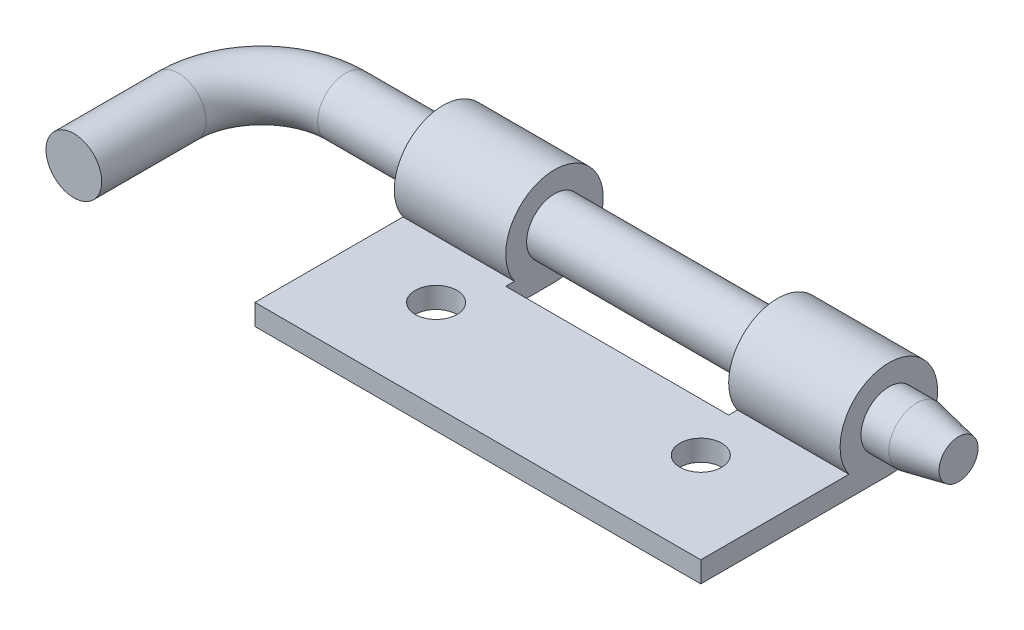
ISO-10303-21;
HEADER;
FILE_DESCRIPTION(('STEP AP214'),'2;1');
FILE_NAME('part.step','',(''),(''),'','','');
FILE_SCHEMA(('AUTOMOTIVE_DESIGN { 1 0 10303 214 1 1 1 1 }'));
ENDSEC;
DATA;
#1=APPLICATION_CONTEXT('core data for automotive mechanical design processes');
#2=APPLICATION_PROTOCOL_DEFINITION('international standard','automotive_design',2000,#1);
#3=PRODUCT_CONTEXT('',#1,'mechanical');
#4=PRODUCT('Part','Part','',(#3));
#5=PRODUCT_RELATED_PRODUCT_CATEGORY('part','',(#4));
#6=PRODUCT_DEFINITION_FORMATION('','',#4);
#7=PRODUCT_DEFINITION_CONTEXT('part definition',#1,'design');
#8=PRODUCT_DEFINITION('design','',#6,#7);
#9=PRODUCT_DEFINITION_SHAPE('','',#8);
#10=(LENGTH_UNIT() NAMED_UNIT(*) SI_UNIT(.MILLI.,.METRE.));
#11=(NAMED_UNIT(*) PLANE_ANGLE_UNIT() SI_UNIT($,.RADIAN.));
#12=(NAMED_UNIT(*) SI_UNIT($,.STERADIAN.) SOLID_ANGLE_UNIT());
#13=UNCERTAINTY_MEASURE_WITH_UNIT(LENGTH_MEASURE(1.E-05),#10,'distance_accuracy_value','');
#14=(GEOMETRIC_REPRESENTATION_CONTEXT(3) GLOBAL_UNCERTAINTY_ASSIGNED_CONTEXT((#13)) GLOBAL_UNIT_ASSIGNED_CONTEXT((#10,
#11,#12)) REPRESENTATION_CONTEXT('',''));
#15=CARTESIAN_POINT('',(0.,0.,0.));
#16=DIRECTION('',(0.,0.,1.));
#17=DIRECTION('',(1.,0.,0.));
#18=AXIS2_PLACEMENT_3D('',#15,#16,#17);
#19=CARTESIAN_POINT('',(37.,0.,0.));
#20=DIRECTION('',(-1.,0.,0.));
#21=DIRECTION('',(0.,0.,1.));
#22=AXIS2_PLACEMENT_3D('',#19,#20,#21);
#23=CYLINDRICAL_SURFACE('',#22,2.);
#24=CARTESIAN_POINT('',(32.,0.,0.));
#25=DIRECTION('',(-1.,0.,0.));
#26=DIRECTION('',(0.,0.,1.));
#27=AXIS2_PLACEMENT_3D('',#24,#25,#26);
#28=CIRCLE('',#27,2.);
#29=CARTESIAN_POINT('',(32.,0.,2.));
#30=VERTEX_POINT('',#29);
#31=EDGE_CURVE('E55',#30,#30,#28,.F.);
#32=ORIENTED_EDGE('',*,*,#31,.T.);
#33=EDGE_LOOP('',(#32));
#34=FACE_BOUND('',#33,.T.);
#35=CARTESIAN_POINT('',(34.,0.,0.));
#36=DIRECTION('',(-1.,0.,0.));
#37=DIRECTION('',(0.,0.,1.));
#38=AXIS2_PLACEMENT_3D('',#35,#36,#37);
#39=CIRCLE('',#38,2.);
#40=CARTESIAN_POINT('',(34.,0.,2.));
#41=VERTEX_POINT('',#40);
#42=EDGE_CURVE('E465',#41,#41,#39,.T.);
#43=ORIENTED_EDGE('',*,*,#42,.T.);
#44=EDGE_LOOP('',(#43));
#45=FACE_BOUND('',#44,.T.);
#46=ADVANCED_FACE('F45',(#34,#45),#23,.T.);
#47=CARTESIAN_POINT('',(8.,0.,0.));
#48=DIRECTION('',(-1.,0.,0.));
#49=DIRECTION('',(0.,0.,1.));
#50=AXIS2_PLACEMENT_3D('',#47,#48,#49);
#51=CYLINDRICAL_SURFACE('',#50,3.5);
#52=CARTESIAN_POINT('',(0.,0.,0.));
#53=DIRECTION('',(1.,0.,0.));
#54=DIRECTION('',(0.,0.,-1.));
#55=AXIS2_PLACEMENT_3D('',#52,#53,#54);
#56=CIRCLE('',#55,3.5);
#57=CARTESIAN_POINT('',(0.,-3.5,0.));
#58=VERTEX_POINT('',#57);
#59=CARTESIAN_POINT('',(0.,-2.,2.87228132326901));
#60=VERTEX_POINT('',#59);
#61=EDGE_CURVE('E174',#58,#60,#56,.T.);
#62=ORIENTED_EDGE('',*,*,#61,.T.);
#63=DIRECTION('',(-1.,0.,0.));
#64=VECTOR('',#63,1.);
#65=CARTESIAN_POINT('',(8.,-2.,2.87228132326901));
#66=LINE('',#65,#64);
#67=CARTESIAN_POINT('',(8.,-2.,2.87228132326901));
#68=VERTEX_POINT('',#67);
#69=EDGE_CURVE('E63',#60,#68,#66,.F.);
#70=ORIENTED_EDGE('',*,*,#69,.T.);
#71=CARTESIAN_POINT('',(8.,0.,0.));
#72=DIRECTION('',(1.,0.,0.));
#73=DIRECTION('',(0.,0.,-1.));
#74=AXIS2_PLACEMENT_3D('',#71,#72,#73);
#75=CIRCLE('',#74,3.5);
#76=CARTESIAN_POINT('',(8.,-3.5,0.));
#77=VERTEX_POINT('',#76);
#78=EDGE_CURVE('E175',#77,#68,#75,.T.);
#79=ORIENTED_EDGE('',*,*,#78,.F.);
#80=DIRECTION('',(-1.,0.,0.));
#81=VECTOR('',#80,1.);
#82=CARTESIAN_POINT('',(0.,-3.5,0.));
#83=LINE('',#82,#81);
#84=EDGE_CURVE('E68',#77,#58,#83,.T.);
#85=ORIENTED_EDGE('',*,*,#84,.T.);
#86=EDGE_LOOP('',(#62,#70,#79,#85));
#87=FACE_BOUND('',#86,.T.);
#88=ADVANCED_FACE('F47',(#87),#51,.T.);
#89=CARTESIAN_POINT('',(8.,0.,0.));
#90=DIRECTION('',(1.,0.,0.));
#91=DIRECTION('',(0.,0.,-1.));
#92=AXIS2_PLACEMENT_3D('',#89,#90,#91);
#93=PLANE('',#92);
#94=CARTESIAN_POINT('',(8.,0.,0.));
#95=DIRECTION('',(1.,0.,0.));
#96=DIRECTION('',(0.,0.,-1.));
#97=AXIS2_PLACEMENT_3D('',#94,#95,#96);
#98=CIRCLE('',#97,2.);
#99=CARTESIAN_POINT('',(8.,0.,-2.));
#100=VERTEX_POINT('',#99);
#101=EDGE_CURVE('E227',#100,#100,#98,.F.);
#102=ORIENTED_EDGE('',*,*,#101,.T.);
#103=EDGE_LOOP('',(#102));
#104=FACE_BOUND('',#103,.T.);
#105=ORIENTED_EDGE('',*,*,#78,.T.);
#106=DIRECTION('',(0.,0.,-1.));
#107=VECTOR('',#106,1.);
#108=CARTESIAN_POINT('',(8.,-2.,0.));
#109=LINE('',#108,#107);
#110=CARTESIAN_POINT('',(8.,-2.,3.5));
#111=VERTEX_POINT('',#110);
#112=EDGE_CURVE('E162',#111,#68,#109,.T.);
#113=ORIENTED_EDGE('',*,*,#112,.F.);
#114=DIRECTION('',(0.,-1.,0.));
#115=VECTOR('',#114,1.);
#116=CARTESIAN_POINT('',(8.,-2.,3.5));
#117=LINE('',#116,#115);
#118=CARTESIAN_POINT('',(8.,-3.5,3.5));
#119=VERTEX_POINT('',#118);
#120=EDGE_CURVE('E157',#111,#119,#117,.T.);
#121=ORIENTED_EDGE('',*,*,#120,.T.);
#122=DIRECTION('',(0.,0.,-1.));
#123=VECTOR('',#122,1.);
#124=CARTESIAN_POINT('',(8.,-3.5,0.));
#125=LINE('',#124,#123);
#126=EDGE_CURVE('E150',#119,#77,#125,.T.);
#127=ORIENTED_EDGE('',*,*,#126,.T.);
#128=EDGE_LOOP('',(#105,#113,#121,#127));
#129=FACE_BOUND('',#128,.T.);
#130=ADVANCED_FACE('F217',(#104,#129),#93,.T.);
#131=CARTESIAN_POINT('',(0.,0.,0.));
#132=DIRECTION('',(1.,0.,0.));
#133=DIRECTION('',(0.,0.,-1.));
#134=AXIS2_PLACEMENT_3D('',#131,#132,#133);
#135=PLANE('',#134);
#136=CARTESIAN_POINT('',(0.,0.,0.));
#137=DIRECTION('',(1.,0.,0.));
#138=DIRECTION('',(0.,0.,-1.));
#139=AXIS2_PLACEMENT_3D('',#136,#137,#138);
#140=CIRCLE('',#139,2.);
#141=CARTESIAN_POINT('',(0.,0.,-2.));
#142=VERTEX_POINT('',#141);
#143=EDGE_CURVE('E11',#142,#142,#140,.F.);
#144=ORIENTED_EDGE('',*,*,#143,.F.);
#145=EDGE_LOOP('',(#144));
#146=FACE_BOUND('',#145,.T.);
#147=ORIENTED_EDGE('',*,*,#61,.F.);
#148=DIRECTION('',(0.,0.,1.));
#149=VECTOR('',#148,1.);
#150=CARTESIAN_POINT('',(0.,-3.5,0.));
#151=LINE('',#150,#149);
#152=CARTESIAN_POINT('',(0.,-3.5,13.5));
#153=VERTEX_POINT('',#152);
#154=EDGE_CURVE('E209',#58,#153,#151,.T.);
#155=ORIENTED_EDGE('',*,*,#154,.T.);
#156=DIRECTION('',(0.,-1.,0.));
#157=VECTOR('',#156,1.);
#158=CARTESIAN_POINT('',(0.,-2.,13.5));
#159=LINE('',#158,#157);
#160=CARTESIAN_POINT('',(0.,-2.,13.5));
#161=VERTEX_POINT('',#160);
#162=EDGE_CURVE('E168',#161,#153,#159,.T.);
#163=ORIENTED_EDGE('',*,*,#162,.F.);
#164=DIRECTION('',(0.,0.,1.));
#165=VECTOR('',#164,1.);
#166=CARTESIAN_POINT('',(0.,-2.,0.));
#167=LINE('',#166,#165);
#168=EDGE_CURVE('E156',#60,#161,#167,.T.);
#169=ORIENTED_EDGE('',*,*,#168,.F.);
#170=EDGE_LOOP('',(#147,#155,#163,#169));
#171=FACE_BOUND('',#170,.T.);
#172=ADVANCED_FACE('F188',(#146,#171),#135,.F.);
#173=CARTESIAN_POINT('',(0.,-2.,0.));
#174=DIRECTION('',(0.,1.,0.));
#175=DIRECTION('',(0.,0.,1.));
#176=AXIS2_PLACEMENT_3D('',#173,#174,#175);
#177=PLANE('',#176);
#178=DIRECTION('',(-1.,0.,0.));
#179=VECTOR('',#178,1.);
#180=CARTESIAN_POINT('',(32.,-2.,2.87228132326901));
#181=LINE('',#180,#179);
#182=CARTESIAN_POINT('',(24.,-2.,2.87228132326901));
#183=VERTEX_POINT('',#182);
#184=CARTESIAN_POINT('',(32.,-2.,2.87228132326901));
#185=VERTEX_POINT('',#184);
#186=EDGE_CURVE('E119',#183,#185,#181,.F.);
#187=ORIENTED_EDGE('',*,*,#186,.F.);
#188=DIRECTION('',(0.,0.,1.));
#189=VECTOR('',#188,1.);
#190=CARTESIAN_POINT('',(24.,-2.,3.5));
#191=LINE('',#190,#189);
#192=CARTESIAN_POINT('',(24.,-2.,3.5));
#193=VERTEX_POINT('',#192);
#194=EDGE_CURVE('E201',#183,#193,#191,.T.);
#195=ORIENTED_EDGE('',*,*,#194,.T.);
#196=DIRECTION('',(-1.,0.,0.));
#197=VECTOR('',#196,1.);
#198=CARTESIAN_POINT('',(8.,-2.,3.5));
#199=LINE('',#198,#197);
#200=EDGE_CURVE('E204',#193,#111,#199,.T.);
#201=ORIENTED_EDGE('',*,*,#200,.T.);
#202=ORIENTED_EDGE('',*,*,#112,.T.);
#203=ORIENTED_EDGE('',*,*,#69,.F.);
#204=ORIENTED_EDGE('',*,*,#168,.T.);
#205=DIRECTION('',(1.,0.,0.));
#206=VECTOR('',#205,1.);
#207=CARTESIAN_POINT('',(0.,-2.,13.5));
#208=LINE('',#207,#206);
#209=CARTESIAN_POINT('',(32.,-2.,13.5));
#210=VERTEX_POINT('',#209);
#211=EDGE_CURVE('E190',#161,#210,#208,.T.);
#212=ORIENTED_EDGE('',*,*,#211,.T.);
#213=DIRECTION('',(0.,0.,-1.));
#214=VECTOR('',#213,1.);
#215=CARTESIAN_POINT('',(32.,-2.,0.));
#216=LINE('',#215,#214);
#217=EDGE_CURVE('E193',#210,#185,#216,.T.);
#218=ORIENTED_EDGE('',*,*,#217,.T.);
#219=EDGE_LOOP('',(#187,#195,#201,#202,#203,#204,#212,#218));
#220=FACE_BOUND('',#219,.T.);
#221=CARTESIAN_POINT('',(6.5,-2.,7.));
#222=DIRECTION('',(0.,1.,0.));
#223=DIRECTION('',(0.,0.,1.));
#224=AXIS2_PLACEMENT_3D('',#221,#222,#223);
#225=CIRCLE('',#224,1.5);
#226=CARTESIAN_POINT('',(6.5,-2.,8.5));
#227=VERTEX_POINT('',#226);
#228=EDGE_CURVE('E237',#227,#227,#225,.T.);
#229=ORIENTED_EDGE('',*,*,#228,.F.);
#230=EDGE_LOOP('',(#229));
#231=FACE_BOUND('',#230,.T.);
#232=CARTESIAN_POINT('',(25.5,-2.,7.));
#233=DIRECTION('',(0.,1.,0.));
#234=DIRECTION('',(0.,0.,1.));
#235=AXIS2_PLACEMENT_3D('',#232,#233,#234);
#236=CIRCLE('',#235,1.5);
#237=CARTESIAN_POINT('',(25.5,-2.,8.5));
#238=VERTEX_POINT('',#237);
#239=EDGE_CURVE('E211',#238,#238,#236,.T.);
#240=ORIENTED_EDGE('',*,*,#239,.F.);
#241=EDGE_LOOP('',(#240));
#242=FACE_BOUND('',#241,.T.);
#243=ADVANCED_FACE('F183',(#220,#231,#242),#177,.T.);
#244=CARTESIAN_POINT('',(0.,-3.5,0.));
#245=DIRECTION('',(0.,1.,0.));
#246=DIRECTION('',(0.,0.,1.));
#247=AXIS2_PLACEMENT_3D('',#244,#245,#246);
#248=PLANE('',#247);
#249=ORIENTED_EDGE('',*,*,#154,.F.);
#250=ORIENTED_EDGE('',*,*,#84,.F.);
#251=ORIENTED_EDGE('',*,*,#126,.F.);
#252=DIRECTION('',(-1.,0.,0.));
#253=VECTOR('',#252,1.);
#254=CARTESIAN_POINT('',(8.,-3.5,3.5));
#255=LINE('',#254,#253);
#256=CARTESIAN_POINT('',(24.,-3.5,3.5));
#257=VERTEX_POINT('',#256);
#258=EDGE_CURVE('E144',#257,#119,#255,.T.);
#259=ORIENTED_EDGE('',*,*,#258,.F.);
#260=DIRECTION('',(0.,0.,1.));
#261=VECTOR('',#260,1.);
#262=CARTESIAN_POINT('',(24.,-3.5,3.5));
#263=LINE('',#262,#261);
#264=CARTESIAN_POINT('',(24.,-3.5,0.));
#265=VERTEX_POINT('',#264);
#266=EDGE_CURVE('E140',#265,#257,#263,.T.);
#267=ORIENTED_EDGE('',*,*,#266,.F.);
#268=DIRECTION('',(-1.,0.,0.));
#269=VECTOR('',#268,1.);
#270=CARTESIAN_POINT('',(24.,-3.5,0.));
#271=LINE('',#270,#269);
#272=CARTESIAN_POINT('',(32.,-3.5,0.));
#273=VERTEX_POINT('',#272);
#274=EDGE_CURVE('E116',#273,#265,#271,.T.);
#275=ORIENTED_EDGE('',*,*,#274,.F.);
#276=DIRECTION('',(0.,0.,-1.));
#277=VECTOR('',#276,1.);
#278=CARTESIAN_POINT('',(32.,-3.5,0.));
#279=LINE('',#278,#277);
#280=CARTESIAN_POINT('',(32.,-3.5,13.5));
#281=VERTEX_POINT('',#280);
#282=EDGE_CURVE('E128',#281,#273,#279,.T.);
#283=ORIENTED_EDGE('',*,*,#282,.F.);
#284=DIRECTION('',(1.,0.,0.));
#285=VECTOR('',#284,1.);
#286=CARTESIAN_POINT('',(0.,-3.5,13.5));
#287=LINE('',#286,#285);
#288=EDGE_CURVE('E134',#153,#281,#287,.T.);
#289=ORIENTED_EDGE('',*,*,#288,.F.);
#290=EDGE_LOOP('',(#249,#250,#251,#259,#267,#275,#283,#289));
#291=FACE_BOUND('',#290,.T.);
#292=CARTESIAN_POINT('',(25.5,-3.5,7.));
#293=DIRECTION('',(0.,1.,0.));
#294=DIRECTION('',(0.,0.,1.));
#295=AXIS2_PLACEMENT_3D('',#292,#293,#294);
#296=CIRCLE('',#295,1.5);
#297=CARTESIAN_POINT('',(25.5,-3.5,8.5));
#298=VERTEX_POINT('',#297);
#299=EDGE_CURVE('E196',#298,#298,#296,.T.);
#300=ORIENTED_EDGE('',*,*,#299,.T.);
#301=EDGE_LOOP('',(#300));
#302=FACE_BOUND('',#301,.T.);
#303=CARTESIAN_POINT('',(6.5,-3.5,7.));
#304=DIRECTION('',(0.,1.,0.));
#305=DIRECTION('',(0.,0.,1.));
#306=AXIS2_PLACEMENT_3D('',#303,#304,#305);
#307=CIRCLE('',#306,1.5);
#308=CARTESIAN_POINT('',(6.5,-3.5,8.5));
#309=VERTEX_POINT('',#308);
#310=EDGE_CURVE('E236',#309,#309,#307,.T.);
#311=ORIENTED_EDGE('',*,*,#310,.T.);
#312=EDGE_LOOP('',(#311));
#313=FACE_BOUND('',#312,.T.);
#314=ADVANCED_FACE('F137',(#291,#302,#313),#248,.F.);
#315=CARTESIAN_POINT('',(0.,-2.,13.5));
#316=DIRECTION('',(0.,0.,-1.));
#317=DIRECTION('',(-1.,0.,0.));
#318=AXIS2_PLACEMENT_3D('',#315,#316,#317);
#319=PLANE('',#318);
#320=ORIENTED_EDGE('',*,*,#288,.T.);
#321=DIRECTION('',(0.,-1.,0.));
#322=VECTOR('',#321,1.);
#323=CARTESIAN_POINT('',(32.,-2.,13.5));
#324=LINE('',#323,#322);
#325=EDGE_CURVE('E131',#210,#281,#324,.T.);
#326=ORIENTED_EDGE('',*,*,#325,.F.);
#327=ORIENTED_EDGE('',*,*,#211,.F.);
#328=ORIENTED_EDGE('',*,*,#162,.T.);
#329=EDGE_LOOP('',(#320,#326,#327,#328));
#330=FACE_BOUND('',#329,.T.);
#331=ADVANCED_FACE('F214',(#330),#319,.F.);
#332=CARTESIAN_POINT('',(32.,-2.,0.));
#333=DIRECTION('',(-1.,0.,0.));
#334=DIRECTION('',(0.,0.,1.));
#335=AXIS2_PLACEMENT_3D('',#332,#333,#334);
#336=PLANE('',#335);
#337=ORIENTED_EDGE('',*,*,#31,.F.);
#338=EDGE_LOOP('',(#337));
#339=FACE_BOUND('',#338,.T.);
#340=CARTESIAN_POINT('',(32.,0.,0.));
#341=DIRECTION('',(-1.,0.,0.));
#342=DIRECTION('',(0.,0.,1.));
#343=AXIS2_PLACEMENT_3D('',#340,#341,#342);
#344=CIRCLE('',#343,3.5);
#345=EDGE_CURVE('E112',#185,#273,#344,.T.);
#346=ORIENTED_EDGE('',*,*,#345,.F.);
#347=ORIENTED_EDGE('',*,*,#217,.F.);
#348=ORIENTED_EDGE('',*,*,#325,.T.);
#349=ORIENTED_EDGE('',*,*,#282,.T.);
#350=EDGE_LOOP('',(#346,#347,#348,#349));
#351=FACE_BOUND('',#350,.T.);
#352=ADVANCED_FACE('F129',(#339,#351),#336,.F.);
#353=CARTESIAN_POINT('',(24.,-2.,3.5));
#354=DIRECTION('',(1.,0.,0.));
#355=DIRECTION('',(0.,0.,-1.));
#356=AXIS2_PLACEMENT_3D('',#353,#354,#355);
#357=PLANE('',#356);
#358=CARTESIAN_POINT('',(24.,0.,0.));
#359=DIRECTION('',(1.,0.,0.));
#360=DIRECTION('',(0.,0.,-1.));
#361=AXIS2_PLACEMENT_3D('',#358,#359,#360);
#362=CIRCLE('',#361,2.);
#363=CARTESIAN_POINT('',(24.,0.,-2.));
#364=VERTEX_POINT('',#363);
#365=EDGE_CURVE('E49',#364,#364,#362,.F.);
#366=ORIENTED_EDGE('',*,*,#365,.F.);
#367=EDGE_LOOP('',(#366));
#368=FACE_BOUND('',#367,.T.);
#369=ORIENTED_EDGE('',*,*,#194,.F.);
#370=CARTESIAN_POINT('',(24.,0.,0.));
#371=DIRECTION('',(-1.,0.,0.));
#372=DIRECTION('',(0.,0.,1.));
#373=AXIS2_PLACEMENT_3D('',#370,#371,#372);
#374=CIRCLE('',#373,3.5);
#375=EDGE_CURVE('E124',#183,#265,#374,.T.);
#376=ORIENTED_EDGE('',*,*,#375,.T.);
#377=ORIENTED_EDGE('',*,*,#266,.T.);
#378=DIRECTION('',(0.,-1.,0.));
#379=VECTOR('',#378,1.);
#380=CARTESIAN_POINT('',(24.,-2.,3.5));
#381=LINE('',#380,#379);
#382=EDGE_CURVE('E161',#193,#257,#381,.T.);
#383=ORIENTED_EDGE('',*,*,#382,.F.);
#384=EDGE_LOOP('',(#369,#376,#377,#383));
#385=FACE_BOUND('',#384,.T.);
#386=ADVANCED_FACE('F225',(#368,#385),#357,.F.);
#387=CARTESIAN_POINT('',(8.,-2.,3.5));
#388=DIRECTION('',(0.,0.,1.));
#389=DIRECTION('',(1.,0.,0.));
#390=AXIS2_PLACEMENT_3D('',#387,#388,#389);
#391=PLANE('',#390);
#392=ORIENTED_EDGE('',*,*,#258,.T.);
#393=ORIENTED_EDGE('',*,*,#120,.F.);
#394=ORIENTED_EDGE('',*,*,#200,.F.);
#395=ORIENTED_EDGE('',*,*,#382,.T.);
#396=EDGE_LOOP('',(#392,#393,#394,#395));
#397=FACE_BOUND('',#396,.T.);
#398=ADVANCED_FACE('F221',(#397),#391,.F.);
#399=CARTESIAN_POINT('',(25.5,-2.,7.));
#400=DIRECTION('',(0.,-1.,0.));
#401=DIRECTION('',(0.,0.,-1.));
#402=AXIS2_PLACEMENT_3D('',#399,#400,#401);
#403=CYLINDRICAL_SURFACE('',#402,1.5);
#404=ORIENTED_EDGE('',*,*,#239,.T.);
#405=EDGE_LOOP('',(#404));
#406=FACE_BOUND('',#405,.T.);
#407=ORIENTED_EDGE('',*,*,#299,.F.);
#408=EDGE_LOOP('',(#407));
#409=FACE_BOUND('',#408,.T.);
#410=ADVANCED_FACE('F252',(#406,#409),#403,.F.);
#411=CARTESIAN_POINT('',(6.5,-2.,7.));
#412=DIRECTION('',(0.,-1.,0.));
#413=DIRECTION('',(0.,0.,-1.));
#414=AXIS2_PLACEMENT_3D('',#411,#412,#413);
#415=CYLINDRICAL_SURFACE('',#414,1.5);
#416=ORIENTED_EDGE('',*,*,#228,.T.);
#417=EDGE_LOOP('',(#416));
#418=FACE_BOUND('',#417,.T.);
#419=ORIENTED_EDGE('',*,*,#310,.F.);
#420=EDGE_LOOP('',(#419));
#421=FACE_BOUND('',#420,.T.);
#422=ADVANCED_FACE('F254',(#418,#421),#415,.F.);
#423=CARTESIAN_POINT('',(32.,0.,0.));
#424=DIRECTION('',(-1.,0.,0.));
#425=DIRECTION('',(0.,0.,1.));
#426=AXIS2_PLACEMENT_3D('',#423,#424,#425);
#427=CYLINDRICAL_SURFACE('',#426,3.5);
#428=ORIENTED_EDGE('',*,*,#375,.F.);
#429=ORIENTED_EDGE('',*,*,#186,.T.);
#430=ORIENTED_EDGE('',*,*,#345,.T.);
#431=ORIENTED_EDGE('',*,*,#274,.T.);
#432=EDGE_LOOP('',(#428,#429,#430,#431));
#433=FACE_BOUND('',#432,.T.);
#434=ADVANCED_FACE('F114',(#433),#427,.T.);
#435=ORIENTED_EDGE('',*,*,#101,.F.);
#436=EDGE_LOOP('',(#435));
#437=FACE_BOUND('',#436,.T.);
#438=ORIENTED_EDGE('',*,*,#365,.T.);
#439=EDGE_LOOP('',(#438));
#440=FACE_BOUND('',#439,.T.);
#441=ADVANCED_FACE('F267',(#437,#440),#23,.T.);
#442=CARTESIAN_POINT('',(-7.,0.,0.));
#443=DIRECTION('',(1.,0.,0.));
#444=DIRECTION('',(0.,0.,-1.));
#445=AXIS2_PLACEMENT_3D('',#442,#443,#444);
#446=CIRCLE('',#445,2.);
#447=CARTESIAN_POINT('',(-7.,0.,-2.));
#448=VERTEX_POINT('',#447);
#449=EDGE_CURVE('E462',#448,#448,#446,.T.);
#450=ORIENTED_EDGE('',*,*,#449,.T.);
#451=EDGE_LOOP('',(#450));
#452=FACE_BOUND('',#451,.T.);
#453=ORIENTED_EDGE('',*,*,#143,.T.);
#454=EDGE_LOOP('',(#453));
#455=FACE_BOUND('',#454,.T.);
#456=ADVANCED_FACE('F268',(#452,#455),#23,.T.);
#457=CARTESIAN_POINT('',(-13.,0.,13.5));
#458=DIRECTION('',(0.,0.,-1.));
#459=DIRECTION('',(-1.,0.,0.));
#460=AXIS2_PLACEMENT_3D('',#457,#458,#459);
#461=PLANE('',#460);
#462=CARTESIAN_POINT('',(-13.,0.,13.5));
#463=DIRECTION('',(0.,0.,-1.));
#464=DIRECTION('',(-1.,0.,0.));
#465=AXIS2_PLACEMENT_3D('',#462,#463,#464);
#466=CIRCLE('',#465,2.);
#467=CARTESIAN_POINT('',(-15.,0.,13.5));
#468=VERTEX_POINT('',#467);
#469=EDGE_CURVE('E231',#468,#468,#466,.T.);
#470=ORIENTED_EDGE('',*,*,#469,.F.);
#471=EDGE_LOOP('',(#470));
#472=FACE_BOUND('',#471,.T.);
#473=ADVANCED_FACE('F281',(#472),#461,.F.);
#474=CARTESIAN_POINT('',(-7.,0.,6.00000000000001));
#475=DIRECTION('',(0.,1.,0.));
#476=DIRECTION('',(0.,0.,1.));
#477=AXIS2_PLACEMENT_3D('',#474,#475,#476);
#478=TOROIDAL_SURFACE('',#477,6.00000000000002,2.);
#479=CARTESIAN_POINT('',(-13.,0.,6.00000000000001));
#480=DIRECTION('',(0.,0.,-1.));
#481=DIRECTION('',(-1.,0.,0.));
#482=AXIS2_PLACEMENT_3D('',#479,#480,#481);
#483=CIRCLE('',#482,2.);
#484=CARTESIAN_POINT('',(-15.,0.,6.00000000000001));
#485=VERTEX_POINT('',#484);
#486=EDGE_CURVE('E458',#485,#485,#483,.T.);
#487=CARTESIAN_POINT('',(-7.,0.,6.00000000000001));
#488=DIRECTION('',(0.,1.,0.));
#489=DIRECTION('',(0.,0.,1.));
#490=AXIS2_PLACEMENT_3D('',#487,#488,#489);
#491=CIRCLE('',#490,8.00000000000001);
#492=EDGE_CURVE('',#448,#485,#491,.T.);
#493=ORIENTED_EDGE('',*,*,#449,.F.);
#494=ORIENTED_EDGE('',*,*,#486,.T.);
#495=ORIENTED_EDGE('',*,*,#492,.T.);
#496=ORIENTED_EDGE('',*,*,#492,.F.);
#497=EDGE_LOOP('',(#493,#495,#494,#496));
#498=FACE_BOUND('',#497,.T.);
#499=ADVANCED_FACE('F287',(#498),#478,.T.);
#500=CARTESIAN_POINT('',(-13.,0.,6.00000000000001));
#501=DIRECTION('',(0.,0.,1.));
#502=DIRECTION('',(1.,0.,0.));
#503=AXIS2_PLACEMENT_3D('',#500,#501,#502);
#504=CYLINDRICAL_SURFACE('',#503,2.);
#505=ORIENTED_EDGE('',*,*,#469,.T.);
#506=EDGE_LOOP('',(#505));
#507=FACE_BOUND('',#506,.T.);
#508=ORIENTED_EDGE('',*,*,#486,.F.);
#509=EDGE_LOOP('',(#508));
#510=FACE_BOUND('',#509,.T.);
#511=ADVANCED_FACE('F283',(#507,#510),#504,.T.);
#512=CARTESIAN_POINT('',(34.,0.,0.));
#513=DIRECTION('',(-1.,0.,0.));
#514=DIRECTION('',(0.,0.,1.));
#515=AXIS2_PLACEMENT_3D('',#512,#513,#514);
#516=CONICAL_SURFACE('',#515,2.,0.197395559849882);
#517=CARTESIAN_POINT('',(37.,0.,0.));
#518=DIRECTION('',(-1.,0.,0.));
#519=DIRECTION('',(0.,0.,1.));
#520=AXIS2_PLACEMENT_3D('',#517,#518,#519);
#521=CIRCLE('',#520,1.4);
#522=CARTESIAN_POINT('',(37.,0.,1.4));
#523=VERTEX_POINT('',#522);
#524=EDGE_CURVE('E469',#523,#523,#521,.T.);
#525=ORIENTED_EDGE('',*,*,#524,.T.);
#526=EDGE_LOOP('',(#525));
#527=FACE_BOUND('',#526,.T.);
#528=ORIENTED_EDGE('',*,*,#42,.F.);
#529=EDGE_LOOP('',(#528));
#530=FACE_BOUND('',#529,.T.);
#531=ADVANCED_FACE('F290',(#527,#530),#516,.T.);
#532=CARTESIAN_POINT('',(37.,0.,0.));
#533=DIRECTION('',(1.,0.,0.));
#534=DIRECTION('',(0.,0.,-1.));
#535=AXIS2_PLACEMENT_3D('',#532,#533,#534);
#536=PLANE('',#535);
#537=ORIENTED_EDGE('',*,*,#524,.F.);
#538=EDGE_LOOP('',(#537));
#539=FACE_BOUND('',#538,.T.);
#540=ADVANCED_FACE('F298',(#539),#536,.T.);
#541=CLOSED_SHELL('',(#46,#88,#130,#172,#243,#314,#331,#352,#386,#398,#410,#422,#434,#441,#456,
#473,#499,#511,#531,#540));
#542=MANIFOLD_SOLID_BREP('B2',#541);
#543=ADVANCED_BREP_SHAPE_REPRESENTATION('',(#18,#542),#14);
#544=SHAPE_DEFINITION_REPRESENTATION(#9,#543);
ENDSEC;
END-ISO-10303-21;
